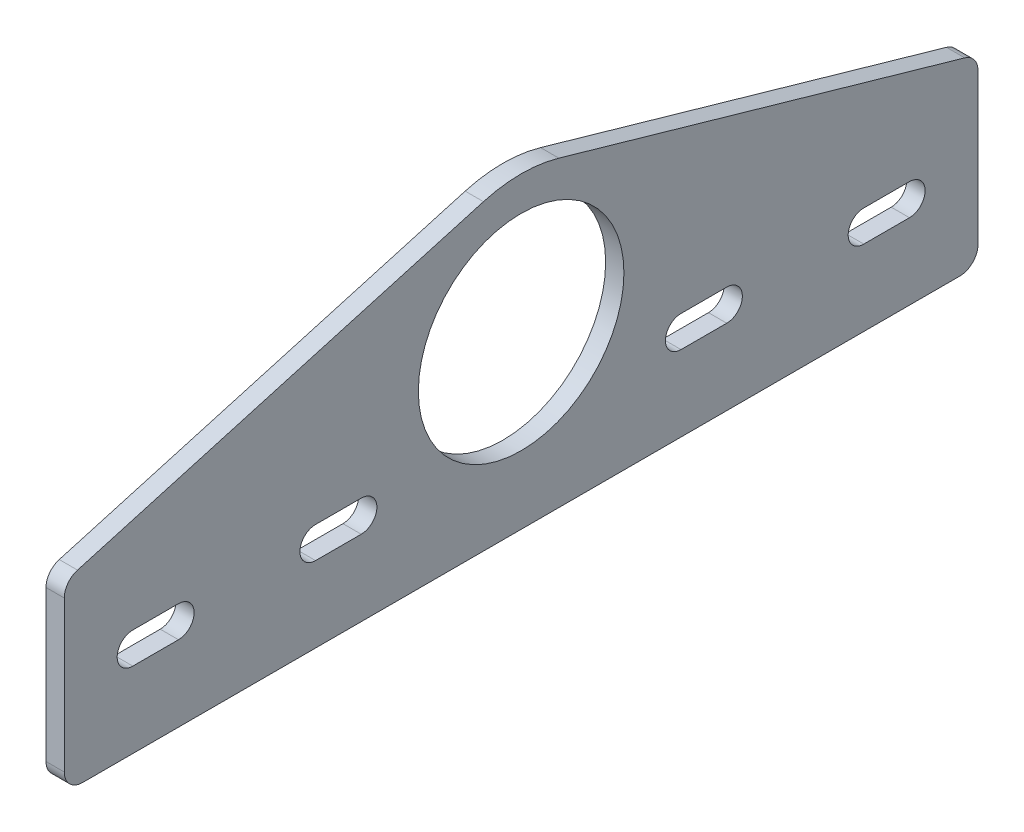
ISO-10303-21;
HEADER;
FILE_DESCRIPTION(('STEP AP214'),'2;1');
FILE_NAME('part.step','',(''),(''),'','','');
FILE_SCHEMA(('AUTOMOTIVE_DESIGN { 1 0 10303 214 1 1 1 1 }'));
ENDSEC;
DATA;
#1=APPLICATION_CONTEXT('core data for automotive mechanical design processes');
#2=APPLICATION_PROTOCOL_DEFINITION('international standard','automotive_design',2000,#1);
#3=PRODUCT_CONTEXT('',#1,'mechanical');
#4=PRODUCT('Part','Part','',(#3));
#5=PRODUCT_RELATED_PRODUCT_CATEGORY('part','',(#4));
#6=PRODUCT_DEFINITION_FORMATION('','',#4);
#7=PRODUCT_DEFINITION_CONTEXT('part definition',#1,'design');
#8=PRODUCT_DEFINITION('design','',#6,#7);
#9=PRODUCT_DEFINITION_SHAPE('','',#8);
#10=(LENGTH_UNIT() NAMED_UNIT(*) SI_UNIT(.MILLI.,.METRE.));
#11=(NAMED_UNIT(*) PLANE_ANGLE_UNIT() SI_UNIT($,.RADIAN.));
#12=(NAMED_UNIT(*) SI_UNIT($,.STERADIAN.) SOLID_ANGLE_UNIT());
#13=UNCERTAINTY_MEASURE_WITH_UNIT(LENGTH_MEASURE(1.E-05),#10,'distance_accuracy_value','');
#14=(GEOMETRIC_REPRESENTATION_CONTEXT(3) GLOBAL_UNCERTAINTY_ASSIGNED_CONTEXT((#13)) GLOBAL_UNIT_ASSIGNED_CONTEXT((#10,
#11,#12)) REPRESENTATION_CONTEXT('',''));
#15=CARTESIAN_POINT('',(0.,0.,0.));
#16=DIRECTION('',(0.,0.,1.));
#17=DIRECTION('',(1.,0.,0.));
#18=AXIS2_PLACEMENT_3D('',#15,#16,#17);
#19=CARTESIAN_POINT('',(2.54,-23.7489999999995,63.4999999999999));
#20=DIRECTION('',(0.,1.,0.));
#21=DIRECTION('',(0.,0.,1.));
#22=AXIS2_PLACEMENT_3D('',#19,#20,#21);
#23=PLANE('',#22);
#24=DIRECTION('',(0.,0.,-1.));
#25=VECTOR('',#24,1.);
#26=CARTESIAN_POINT('',(2.54,-23.7489999999995,63.4999999999999));
#27=LINE('',#26,#25);
#28=CARTESIAN_POINT('',(2.54,-23.7489999999995,60.9599999999999));
#29=VERTEX_POINT('',#28);
#30=CARTESIAN_POINT('',(2.54,-23.7489999999995,-60.9600000000001));
#31=VERTEX_POINT('',#30);
#32=EDGE_CURVE('E429',#29,#31,#27,.T.);
#33=ORIENTED_EDGE('',*,*,#32,.F.);
#34=DIRECTION('',(-1.,0.,0.));
#35=VECTOR('',#34,1.);
#36=CARTESIAN_POINT('',(0.,-23.7489999999995,60.9599999999999));
#37=LINE('',#36,#35);
#38=CARTESIAN_POINT('',(0.,-23.7489999999995,60.9599999999999));
#39=VERTEX_POINT('',#38);
#40=EDGE_CURVE('E504',#29,#39,#37,.T.);
#41=ORIENTED_EDGE('',*,*,#40,.T.);
#42=DIRECTION('',(0.,0.,-1.));
#43=VECTOR('',#42,1.);
#44=CARTESIAN_POINT('',(0.,-23.7489999999995,63.4999999999999));
#45=LINE('',#44,#43);
#46=CARTESIAN_POINT('',(0.,-23.7489999999995,-60.9600000000001));
#47=VERTEX_POINT('',#46);
#48=EDGE_CURVE('E425',#39,#47,#45,.T.);
#49=ORIENTED_EDGE('',*,*,#48,.T.);
#50=DIRECTION('',(-1.,0.,0.));
#51=VECTOR('',#50,1.);
#52=CARTESIAN_POINT('',(2.54,-23.7489999999995,-60.9600000000001));
#53=LINE('',#52,#51);
#54=EDGE_CURVE('E501',#47,#31,#53,.F.);
#55=ORIENTED_EDGE('',*,*,#54,.T.);
#56=EDGE_LOOP('',(#33,#41,#49,#55));
#57=FACE_BOUND('',#56,.T.);
#58=ADVANCED_FACE('F41',(#57),#23,.F.);
#59=CARTESIAN_POINT('',(2.54,-23.7489999999995,-63.5000000000001));
#60=DIRECTION('',(0.,0.,1.));
#61=DIRECTION('',(0.,-1.,0.));
#62=AXIS2_PLACEMENT_3D('',#59,#60,#61);
#63=PLANE('',#62);
#64=DIRECTION('',(0.,1.,0.));
#65=VECTOR('',#64,1.);
#66=CARTESIAN_POINT('',(2.54,-23.7489999999995,-63.5000000000001));
#67=LINE('',#66,#65);
#68=CARTESIAN_POINT('',(2.54,-21.2089999999995,-63.5000000000001));
#69=VERTEX_POINT('',#68);
#70=CARTESIAN_POINT('',(2.54,-0.264342598477369,-63.5000000000001));
#71=VERTEX_POINT('',#70);
#72=EDGE_CURVE('E433',#69,#71,#67,.T.);
#73=ORIENTED_EDGE('',*,*,#72,.F.);
#74=DIRECTION('',(-1.,0.,0.));
#75=VECTOR('',#74,1.);
#76=CARTESIAN_POINT('',(2.54,-21.2089999999995,-63.5000000000001));
#77=LINE('',#76,#75);
#78=CARTESIAN_POINT('',(0.,-21.2089999999995,-63.5000000000001));
#79=VERTEX_POINT('',#78);
#80=EDGE_CURVE('E49',#69,#79,#77,.T.);
#81=ORIENTED_EDGE('',*,*,#80,.T.);
#82=DIRECTION('',(0.,1.,0.));
#83=VECTOR('',#82,1.);
#84=CARTESIAN_POINT('',(0.,-23.7489999999995,-63.5000000000001));
#85=LINE('',#84,#83);
#86=CARTESIAN_POINT('',(0.,-0.264342598477369,-63.5000000000001));
#87=VERTEX_POINT('',#86);
#88=EDGE_CURVE('E454',#79,#87,#85,.T.);
#89=ORIENTED_EDGE('',*,*,#88,.T.);
#90=DIRECTION('',(-1.,0.,0.));
#91=VECTOR('',#90,1.);
#92=CARTESIAN_POINT('',(2.54,-0.264342598477362,-63.5000000000001));
#93=LINE('',#92,#91);
#94=EDGE_CURVE('E64',#87,#71,#93,.F.);
#95=ORIENTED_EDGE('',*,*,#94,.T.);
#96=EDGE_LOOP('',(#73,#81,#89,#95));
#97=FACE_BOUND('',#96,.T.);
#98=ADVANCED_FACE('F511',(#97),#63,.F.);
#99=CARTESIAN_POINT('',(2.54,1.65100000000048,-63.5000000000001));
#100=DIRECTION('',(0.,-0.961443520094269,0.275002468477541));
#101=DIRECTION('',(0.,-0.275002468477541,-0.961443520094269));
#102=AXIS2_PLACEMENT_3D('',#99,#100,#101);
#103=PLANE('',#102);
#104=DIRECTION('',(0.,0.275002468477541,0.961443520094269));
#105=VECTOR('',#104,1.);
#106=CARTESIAN_POINT('',(2.54,1.65100000000048,-63.5000000000001));
#107=LINE('',#106,#105);
#108=CARTESIAN_POINT('',(2.54,2.17772394256208,-61.6585062699331));
#109=VERTEX_POINT('',#108);
#110=CARTESIAN_POINT('',(2.54,18.3154990577958,-5.23879702449716));
#111=VERTEX_POINT('',#110);
#112=EDGE_CURVE('E437',#109,#111,#107,.T.);
#113=ORIENTED_EDGE('',*,*,#112,.F.);
#114=DIRECTION('',(-1.,0.,0.));
#115=VECTOR('',#114,1.);
#116=CARTESIAN_POINT('',(2.54,2.17772394256208,-61.6585062699331));
#117=LINE('',#116,#115);
#118=CARTESIAN_POINT('',(0.,2.17772394256208,-61.6585062699331));
#119=VERTEX_POINT('',#118);
#120=EDGE_CURVE('E11',#109,#119,#117,.T.);
#121=ORIENTED_EDGE('',*,*,#120,.T.);
#122=DIRECTION('',(0.,0.275002468477541,0.961443520094269));
#123=VECTOR('',#122,1.);
#124=CARTESIAN_POINT('',(0.,1.65100000000048,-63.5000000000001));
#125=LINE('',#124,#123);
#126=CARTESIAN_POINT('',(0.,18.3154990577958,-5.23879702449716));
#127=VERTEX_POINT('',#126);
#128=EDGE_CURVE('E457',#119,#127,#125,.T.);
#129=ORIENTED_EDGE('',*,*,#128,.T.);
#130=DIRECTION('',(-1.,0.,0.));
#131=VECTOR('',#130,1.);
#132=CARTESIAN_POINT('',(2.54,18.3154990577958,-5.23879702449716));
#133=LINE('',#132,#131);
#134=EDGE_CURVE('E473',#111,#127,#133,.T.);
#135=ORIENTED_EDGE('',*,*,#134,.F.);
#136=EDGE_LOOP('',(#113,#121,#129,#135));
#137=FACE_BOUND('',#136,.T.);
#138=ADVANCED_FACE('F522',(#137),#103,.F.);
#139=CARTESIAN_POINT('',(2.54,0.,0.));
#140=DIRECTION('',(-1.,0.,0.));
#141=DIRECTION('',(0.,0.,1.));
#142=AXIS2_PLACEMENT_3D('',#139,#140,#141);
#143=CYLINDRICAL_SURFACE('',#142,19.05);
#144=CARTESIAN_POINT('',(0.,0.,0.));
#145=DIRECTION('',(1.,0.,0.));
#146=DIRECTION('',(0.,0.,-1.));
#147=AXIS2_PLACEMENT_3D('',#144,#145,#146);
#148=CIRCLE('',#147,19.05);
#149=CARTESIAN_POINT('',(0.,18.3154990577958,5.23879702449718));
#150=VERTEX_POINT('',#149);
#151=EDGE_CURVE('E460',#127,#150,#148,.T.);
#152=ORIENTED_EDGE('',*,*,#151,.T.);
#153=DIRECTION('',(-1.,0.,0.));
#154=VECTOR('',#153,1.);
#155=CARTESIAN_POINT('',(2.54,18.3154990577958,5.23879702449718));
#156=LINE('',#155,#154);
#157=CARTESIAN_POINT('',(2.54,18.3154990577958,5.23879702449718));
#158=VERTEX_POINT('',#157);
#159=EDGE_CURVE('E450',#158,#150,#156,.T.);
#160=ORIENTED_EDGE('',*,*,#159,.F.);
#161=CARTESIAN_POINT('',(2.54,0.,0.));
#162=DIRECTION('',(1.,0.,0.));
#163=DIRECTION('',(0.,0.,-1.));
#164=AXIS2_PLACEMENT_3D('',#161,#162,#163);
#165=CIRCLE('',#164,19.05);
#166=EDGE_CURVE('E440',#111,#158,#165,.T.);
#167=ORIENTED_EDGE('',*,*,#166,.F.);
#168=ORIENTED_EDGE('',*,*,#134,.T.);
#169=EDGE_LOOP('',(#152,#160,#167,#168));
#170=FACE_BOUND('',#169,.T.);
#171=ADVANCED_FACE('F529',(#170),#143,.T.);
#172=CARTESIAN_POINT('',(2.54,18.3154990577958,5.23879702449718));
#173=DIRECTION('',(0.,-0.961443520094269,-0.275002468477542));
#174=DIRECTION('',(0.,0.275002468477542,-0.961443520094269));
#175=AXIS2_PLACEMENT_3D('',#172,#173,#174);
#176=PLANE('',#175);
#177=DIRECTION('',(0.,-0.275002468477542,0.961443520094269));
#178=VECTOR('',#177,1.);
#179=CARTESIAN_POINT('',(0.,18.3154990577958,5.23879702449718));
#180=LINE('',#179,#178);
#181=CARTESIAN_POINT('',(0.,2.17772394256208,61.6585062699328));
#182=VERTEX_POINT('',#181);
#183=EDGE_CURVE('E463',#150,#182,#180,.T.);
#184=ORIENTED_EDGE('',*,*,#183,.T.);
#185=DIRECTION('',(-1.,0.,0.));
#186=VECTOR('',#185,1.);
#187=CARTESIAN_POINT('',(2.54,2.17772394256208,61.6585062699328));
#188=LINE('',#187,#186);
#189=CARTESIAN_POINT('',(2.54,2.17772394256208,61.6585062699328));
#190=VERTEX_POINT('',#189);
#191=EDGE_CURVE('E491',#182,#190,#188,.F.);
#192=ORIENTED_EDGE('',*,*,#191,.T.);
#193=DIRECTION('',(0.,-0.275002468477542,0.961443520094269));
#194=VECTOR('',#193,1.);
#195=CARTESIAN_POINT('',(2.54,18.3154990577958,5.23879702449718));
#196=LINE('',#195,#194);
#197=EDGE_CURVE('E443',#158,#190,#196,.T.);
#198=ORIENTED_EDGE('',*,*,#197,.F.);
#199=ORIENTED_EDGE('',*,*,#159,.T.);
#200=EDGE_LOOP('',(#184,#192,#198,#199));
#201=FACE_BOUND('',#200,.T.);
#202=ADVANCED_FACE('F532',(#201),#176,.F.);
#203=CARTESIAN_POINT('',(2.54,-23.7489999999995,63.4999999999999));
#204=DIRECTION('',(0.,0.,1.));
#205=DIRECTION('',(0.,-1.,0.));
#206=AXIS2_PLACEMENT_3D('',#203,#204,#205);
#207=PLANE('',#206);
#208=DIRECTION('',(0.,1.,0.));
#209=VECTOR('',#208,1.);
#210=CARTESIAN_POINT('',(2.54,-23.7489999999995,63.4999999999999));
#211=LINE('',#210,#209);
#212=CARTESIAN_POINT('',(2.54,-21.2089999999995,63.4999999999999));
#213=VERTEX_POINT('',#212);
#214=CARTESIAN_POINT('',(2.54,-0.264342598477369,63.4999999999999));
#215=VERTEX_POINT('',#214);
#216=EDGE_CURVE('E447',#213,#215,#211,.T.);
#217=ORIENTED_EDGE('',*,*,#216,.T.);
#218=DIRECTION('',(-1.,0.,0.));
#219=VECTOR('',#218,1.);
#220=CARTESIAN_POINT('',(0.,-0.264342598477361,63.4999999999999));
#221=LINE('',#220,#219);
#222=CARTESIAN_POINT('',(0.,-0.264342598477369,63.4999999999999));
#223=VERTEX_POINT('',#222);
#224=EDGE_CURVE('E479',#215,#223,#221,.T.);
#225=ORIENTED_EDGE('',*,*,#224,.T.);
#226=DIRECTION('',(0.,1.,0.));
#227=VECTOR('',#226,1.);
#228=CARTESIAN_POINT('',(0.,-23.7489999999995,63.4999999999999));
#229=LINE('',#228,#227);
#230=CARTESIAN_POINT('',(0.,-21.2089999999995,63.4999999999999));
#231=VERTEX_POINT('',#230);
#232=EDGE_CURVE('E434',#231,#223,#229,.T.);
#233=ORIENTED_EDGE('',*,*,#232,.F.);
#234=DIRECTION('',(-1.,0.,0.));
#235=VECTOR('',#234,1.);
#236=CARTESIAN_POINT('',(2.54,-21.2089999999995,63.4999999999999));
#237=LINE('',#236,#235);
#238=EDGE_CURVE('E477',#231,#213,#237,.F.);
#239=ORIENTED_EDGE('',*,*,#238,.T.);
#240=EDGE_LOOP('',(#217,#225,#233,#239));
#241=FACE_BOUND('',#240,.T.);
#242=ADVANCED_FACE('F540',(#241),#207,.T.);
#243=CARTESIAN_POINT('',(2.54,0.,0.));
#244=DIRECTION('',(1.,0.,0.));
#245=DIRECTION('',(0.,0.,-1.));
#246=AXIS2_PLACEMENT_3D('',#243,#244,#245);
#247=PLANE('',#246);
#248=CARTESIAN_POINT('',(2.54,-11.0489999999995,47.6249999999998));
#249=DIRECTION('',(-1.,0.,0.));
#250=DIRECTION('',(0.,0.,1.));
#251=AXIS2_PLACEMENT_3D('',#248,#249,#250);
#252=CIRCLE('',#251,2.1717);
#253=CARTESIAN_POINT('',(2.54,-8.87729999999952,47.6249999999998));
#254=VERTEX_POINT('',#253);
#255=CARTESIAN_POINT('',(2.54,-13.2206999999995,47.6249999999998));
#256=VERTEX_POINT('',#255);
#257=EDGE_CURVE('E390',#254,#256,#252,.T.);
#258=ORIENTED_EDGE('',*,*,#257,.T.);
#259=DIRECTION('',(0.,0.,1.));
#260=VECTOR('',#259,1.);
#261=CARTESIAN_POINT('',(2.54,-13.2206999999995,47.6249999999998));
#262=LINE('',#261,#260);
#263=CARTESIAN_POINT('',(2.54,-13.2206999999995,53.9749999999998));
#264=VERTEX_POINT('',#263);
#265=EDGE_CURVE('E393',#256,#264,#262,.T.);
#266=ORIENTED_EDGE('',*,*,#265,.T.);
#267=CARTESIAN_POINT('',(2.54,-11.0489999999995,53.9749999999998));
#268=DIRECTION('',(-1.,0.,0.));
#269=DIRECTION('',(0.,0.,1.));
#270=AXIS2_PLACEMENT_3D('',#267,#268,#269);
#271=CIRCLE('',#270,2.1717);
#272=CARTESIAN_POINT('',(2.54,-8.87729999999952,53.9749999999998));
#273=VERTEX_POINT('',#272);
#274=EDGE_CURVE('E397',#264,#273,#271,.T.);
#275=ORIENTED_EDGE('',*,*,#274,.T.);
#276=DIRECTION('',(0.,0.,-1.));
#277=VECTOR('',#276,1.);
#278=CARTESIAN_POINT('',(2.54,-8.87729999999952,47.6249999999998));
#279=LINE('',#278,#277);
#280=EDGE_CURVE('E400',#273,#254,#279,.T.);
#281=ORIENTED_EDGE('',*,*,#280,.T.);
#282=EDGE_LOOP('',(#258,#266,#275,#281));
#283=FACE_BOUND('',#282,.T.);
#284=CARTESIAN_POINT('',(2.54,-11.0489999999995,22.2249999999998));
#285=DIRECTION('',(-1.,0.,0.));
#286=DIRECTION('',(0.,0.,1.));
#287=AXIS2_PLACEMENT_3D('',#284,#285,#286);
#288=CIRCLE('',#287,2.1717);
#289=CARTESIAN_POINT('',(2.54,-8.87729999999952,22.2249999999998));
#290=VERTEX_POINT('',#289);
#291=CARTESIAN_POINT('',(2.54,-13.2206999999995,22.2249999999998));
#292=VERTEX_POINT('',#291);
#293=EDGE_CURVE('E346',#290,#292,#288,.T.);
#294=ORIENTED_EDGE('',*,*,#293,.T.);
#295=DIRECTION('',(0.,0.,1.));
#296=VECTOR('',#295,1.);
#297=CARTESIAN_POINT('',(2.54,-13.2206999999995,22.2249999999998));
#298=LINE('',#297,#296);
#299=CARTESIAN_POINT('',(2.54,-13.2206999999995,28.5749999999998));
#300=VERTEX_POINT('',#299);
#301=EDGE_CURVE('E350',#292,#300,#298,.T.);
#302=ORIENTED_EDGE('',*,*,#301,.T.);
#303=CARTESIAN_POINT('',(2.54,-11.0489999999995,28.5749999999998));
#304=DIRECTION('',(-1.,0.,0.));
#305=DIRECTION('',(0.,0.,1.));
#306=AXIS2_PLACEMENT_3D('',#303,#304,#305);
#307=CIRCLE('',#306,2.1717);
#308=CARTESIAN_POINT('',(2.54,-8.87729999999952,28.5749999999998));
#309=VERTEX_POINT('',#308);
#310=EDGE_CURVE('E355',#300,#309,#307,.T.);
#311=ORIENTED_EDGE('',*,*,#310,.T.);
#312=DIRECTION('',(0.,0.,-1.));
#313=VECTOR('',#312,1.);
#314=CARTESIAN_POINT('',(2.54,-8.87729999999952,22.2249999999998));
#315=LINE('',#314,#313);
#316=EDGE_CURVE('E359',#309,#290,#315,.T.);
#317=ORIENTED_EDGE('',*,*,#316,.T.);
#318=EDGE_LOOP('',(#294,#302,#311,#317));
#319=FACE_BOUND('',#318,.T.);
#320=CARTESIAN_POINT('',(2.54,-11.0489999999995,-28.5750000000001));
#321=DIRECTION('',(-1.,0.,0.));
#322=DIRECTION('',(0.,0.,1.));
#323=AXIS2_PLACEMENT_3D('',#320,#321,#322);
#324=CIRCLE('',#323,2.1717);
#325=CARTESIAN_POINT('',(2.54,-8.87729999999952,-28.5750000000001));
#326=VERTEX_POINT('',#325);
#327=CARTESIAN_POINT('',(2.54,-13.2206999999995,-28.5750000000001));
#328=VERTEX_POINT('',#327);
#329=EDGE_CURVE('E302',#326,#328,#324,.T.);
#330=ORIENTED_EDGE('',*,*,#329,.T.);
#331=DIRECTION('',(0.,0.,1.));
#332=VECTOR('',#331,1.);
#333=CARTESIAN_POINT('',(2.54,-13.2206999999995,-28.5750000000001));
#334=LINE('',#333,#332);
#335=CARTESIAN_POINT('',(2.54,-13.2206999999995,-22.2250000000001));
#336=VERTEX_POINT('',#335);
#337=EDGE_CURVE('E306',#328,#336,#334,.T.);
#338=ORIENTED_EDGE('',*,*,#337,.T.);
#339=CARTESIAN_POINT('',(2.54,-11.0489999999995,-22.2250000000001));
#340=DIRECTION('',(-1.,0.,0.));
#341=DIRECTION('',(0.,0.,1.));
#342=AXIS2_PLACEMENT_3D('',#339,#340,#341);
#343=CIRCLE('',#342,2.1717);
#344=CARTESIAN_POINT('',(2.54,-8.87729999999952,-22.2250000000001));
#345=VERTEX_POINT('',#344);
#346=EDGE_CURVE('E311',#336,#345,#343,.T.);
#347=ORIENTED_EDGE('',*,*,#346,.T.);
#348=DIRECTION('',(0.,0.,-1.));
#349=VECTOR('',#348,1.);
#350=CARTESIAN_POINT('',(2.54,-8.87729999999952,-28.5750000000001));
#351=LINE('',#350,#349);
#352=EDGE_CURVE('E315',#345,#326,#351,.T.);
#353=ORIENTED_EDGE('',*,*,#352,.T.);
#354=EDGE_LOOP('',(#330,#338,#347,#353));
#355=FACE_BOUND('',#354,.T.);
#356=CARTESIAN_POINT('',(2.54,-11.0489999999995,-53.9750000000001));
#357=DIRECTION('',(-1.,0.,0.));
#358=DIRECTION('',(0.,0.,1.));
#359=AXIS2_PLACEMENT_3D('',#356,#357,#358);
#360=CIRCLE('',#359,2.1717);
#361=CARTESIAN_POINT('',(2.54,-8.87729999999952,-53.9750000000001));
#362=VERTEX_POINT('',#361);
#363=CARTESIAN_POINT('',(2.54,-13.2206999999995,-53.9750000000001));
#364=VERTEX_POINT('',#363);
#365=EDGE_CURVE('E250',#362,#364,#360,.T.);
#366=ORIENTED_EDGE('',*,*,#365,.T.);
#367=DIRECTION('',(0.,0.,1.));
#368=VECTOR('',#367,1.);
#369=CARTESIAN_POINT('',(2.54,-13.2206999999995,-53.9750000000001));
#370=LINE('',#369,#368);
#371=CARTESIAN_POINT('',(2.54,-13.2206999999995,-47.6250000000001));
#372=VERTEX_POINT('',#371);
#373=EDGE_CURVE('E263',#364,#372,#370,.T.);
#374=ORIENTED_EDGE('',*,*,#373,.T.);
#375=CARTESIAN_POINT('',(2.54,-11.0489999999995,-47.6250000000001));
#376=DIRECTION('',(-1.,0.,0.));
#377=DIRECTION('',(0.,0.,1.));
#378=AXIS2_PLACEMENT_3D('',#375,#376,#377);
#379=CIRCLE('',#378,2.1717);
#380=CARTESIAN_POINT('',(2.54,-8.87729999999952,-47.6250000000001));
#381=VERTEX_POINT('',#380);
#382=EDGE_CURVE('E268',#372,#381,#379,.T.);
#383=ORIENTED_EDGE('',*,*,#382,.T.);
#384=DIRECTION('',(0.,0.,-1.));
#385=VECTOR('',#384,1.);
#386=CARTESIAN_POINT('',(2.54,-8.87729999999952,-53.9750000000001));
#387=LINE('',#386,#385);
#388=EDGE_CURVE('E259',#381,#362,#387,.T.);
#389=ORIENTED_EDGE('',*,*,#388,.T.);
#390=EDGE_LOOP('',(#366,#374,#383,#389));
#391=FACE_BOUND('',#390,.T.);
#392=CARTESIAN_POINT('',(2.54,0.,0.));
#393=DIRECTION('',(-1.,0.,0.));
#394=DIRECTION('',(0.,0.,1.));
#395=AXIS2_PLACEMENT_3D('',#392,#393,#394);
#396=CIRCLE('',#395,14.2875);
#397=CARTESIAN_POINT('',(2.54,0.,14.2875));
#398=VERTEX_POINT('',#397);
#399=EDGE_CURVE('E421',#398,#398,#396,.T.);
#400=ORIENTED_EDGE('',*,*,#399,.T.);
#401=EDGE_LOOP('',(#400));
#402=FACE_BOUND('',#401,.T.);
#403=ORIENTED_EDGE('',*,*,#197,.T.);
#404=CARTESIAN_POINT('',(2.54,-0.264342598477362,60.9599999999999));
#405=DIRECTION('',(1.,0.,0.));
#406=DIRECTION('',(0.,0.,-1.));
#407=AXIS2_PLACEMENT_3D('',#404,#405,#406);
#408=CIRCLE('',#407,2.54);
#409=EDGE_CURVE('E499',#190,#215,#408,.T.);
#410=ORIENTED_EDGE('',*,*,#409,.T.);
#411=ORIENTED_EDGE('',*,*,#216,.F.);
#412=CARTESIAN_POINT('',(2.54,-21.2089999999995,60.9599999999999));
#413=DIRECTION('',(1.,0.,0.));
#414=DIRECTION('',(0.,0.,-1.));
#415=AXIS2_PLACEMENT_3D('',#412,#413,#414);
#416=CIRCLE('',#415,2.54);
#417=EDGE_CURVE('E497',#213,#29,#416,.T.);
#418=ORIENTED_EDGE('',*,*,#417,.T.);
#419=ORIENTED_EDGE('',*,*,#32,.T.);
#420=CARTESIAN_POINT('',(2.54,-21.2089999999995,-60.9600000000001));
#421=DIRECTION('',(1.,0.,0.));
#422=DIRECTION('',(0.,0.,-1.));
#423=AXIS2_PLACEMENT_3D('',#420,#421,#422);
#424=CIRCLE('',#423,2.54);
#425=EDGE_CURVE('E494',#31,#69,#424,.T.);
#426=ORIENTED_EDGE('',*,*,#425,.T.);
#427=ORIENTED_EDGE('',*,*,#72,.T.);
#428=CARTESIAN_POINT('',(2.54,-0.264342598477365,-60.9600000000001));
#429=DIRECTION('',(1.,0.,0.));
#430=DIRECTION('',(0.,0.,-1.));
#431=AXIS2_PLACEMENT_3D('',#428,#429,#430);
#432=CIRCLE('',#431,2.54);
#433=EDGE_CURVE('E56',#71,#109,#432,.T.);
#434=ORIENTED_EDGE('',*,*,#433,.T.);
#435=ORIENTED_EDGE('',*,*,#112,.T.);
#436=ORIENTED_EDGE('',*,*,#166,.T.);
#437=EDGE_LOOP('',(#403,#410,#411,#418,#419,#426,#427,#434,#435,#436));
#438=FACE_BOUND('',#437,.T.);
#439=ADVANCED_FACE('F270',(#283,#319,#355,#391,#402,#438),#247,.T.);
#440=CARTESIAN_POINT('',(0.,0.,0.));
#441=DIRECTION('',(1.,0.,0.));
#442=DIRECTION('',(0.,0.,-1.));
#443=AXIS2_PLACEMENT_3D('',#440,#441,#442);
#444=PLANE('',#443);
#445=DIRECTION('',(0.,0.,1.));
#446=VECTOR('',#445,1.);
#447=CARTESIAN_POINT('',(0.,-13.2206999999995,47.6249999999998));
#448=LINE('',#447,#446);
#449=CARTESIAN_POINT('',(0.,-13.2206999999995,47.6249999999998));
#450=VERTEX_POINT('',#449);
#451=CARTESIAN_POINT('',(0.,-13.2206999999995,53.9749999999998));
#452=VERTEX_POINT('',#451);
#453=EDGE_CURVE('E406',#450,#452,#448,.T.);
#454=ORIENTED_EDGE('',*,*,#453,.F.);
#455=CARTESIAN_POINT('',(0.,-11.0489999999995,47.6249999999998));
#456=DIRECTION('',(-1.,0.,0.));
#457=DIRECTION('',(0.,0.,1.));
#458=AXIS2_PLACEMENT_3D('',#455,#456,#457);
#459=CIRCLE('',#458,2.1717);
#460=CARTESIAN_POINT('',(0.,-8.87729999999952,47.6249999999998));
#461=VERTEX_POINT('',#460);
#462=EDGE_CURVE('E404',#461,#450,#459,.T.);
#463=ORIENTED_EDGE('',*,*,#462,.F.);
#464=DIRECTION('',(0.,0.,-1.));
#465=VECTOR('',#464,1.);
#466=CARTESIAN_POINT('',(0.,-8.87729999999952,47.6249999999998));
#467=LINE('',#466,#465);
#468=CARTESIAN_POINT('',(0.,-8.87729999999952,53.9749999999998));
#469=VERTEX_POINT('',#468);
#470=EDGE_CURVE('E394',#469,#461,#467,.T.);
#471=ORIENTED_EDGE('',*,*,#470,.F.);
#472=CARTESIAN_POINT('',(0.,-11.0489999999995,53.9749999999998));
#473=DIRECTION('',(-1.,0.,0.));
#474=DIRECTION('',(0.,0.,1.));
#475=AXIS2_PLACEMENT_3D('',#472,#473,#474);
#476=CIRCLE('',#475,2.1717);
#477=EDGE_CURVE('E409',#452,#469,#476,.T.);
#478=ORIENTED_EDGE('',*,*,#477,.F.);
#479=EDGE_LOOP('',(#454,#463,#471,#478));
#480=FACE_BOUND('',#479,.T.);
#481=DIRECTION('',(0.,0.,1.));
#482=VECTOR('',#481,1.);
#483=CARTESIAN_POINT('',(0.,-13.2206999999995,22.2249999999998));
#484=LINE('',#483,#482);
#485=CARTESIAN_POINT('',(0.,-13.2206999999995,22.2249999999998));
#486=VERTEX_POINT('',#485);
#487=CARTESIAN_POINT('',(0.,-13.2206999999995,28.5749999999998));
#488=VERTEX_POINT('',#487);
#489=EDGE_CURVE('E367',#486,#488,#484,.T.);
#490=ORIENTED_EDGE('',*,*,#489,.F.);
#491=CARTESIAN_POINT('',(0.,-11.0489999999995,22.2249999999998));
#492=DIRECTION('',(-1.,0.,0.));
#493=DIRECTION('',(0.,0.,1.));
#494=AXIS2_PLACEMENT_3D('',#491,#492,#493);
#495=CIRCLE('',#494,2.1717);
#496=CARTESIAN_POINT('',(0.,-8.87729999999952,22.2249999999998));
#497=VERTEX_POINT('',#496);
#498=EDGE_CURVE('E364',#497,#486,#495,.T.);
#499=ORIENTED_EDGE('',*,*,#498,.F.);
#500=DIRECTION('',(0.,0.,-1.));
#501=VECTOR('',#500,1.);
#502=CARTESIAN_POINT('',(0.,-8.87729999999952,22.2249999999998));
#503=LINE('',#502,#501);
#504=CARTESIAN_POINT('',(0.,-8.87729999999952,28.5749999999998));
#505=VERTEX_POINT('',#504);
#506=EDGE_CURVE('E351',#505,#497,#503,.T.);
#507=ORIENTED_EDGE('',*,*,#506,.F.);
#508=CARTESIAN_POINT('',(0.,-11.0489999999995,28.5749999999998));
#509=DIRECTION('',(-1.,0.,0.));
#510=DIRECTION('',(0.,0.,1.));
#511=AXIS2_PLACEMENT_3D('',#508,#509,#510);
#512=CIRCLE('',#511,2.1717);
#513=EDGE_CURVE('E372',#488,#505,#512,.T.);
#514=ORIENTED_EDGE('',*,*,#513,.F.);
#515=EDGE_LOOP('',(#490,#499,#507,#514));
#516=FACE_BOUND('',#515,.T.);
#517=DIRECTION('',(0.,0.,1.));
#518=VECTOR('',#517,1.);
#519=CARTESIAN_POINT('',(0.,-13.2206999999995,-28.5750000000001));
#520=LINE('',#519,#518);
#521=CARTESIAN_POINT('',(0.,-13.2206999999995,-28.5750000000001));
#522=VERTEX_POINT('',#521);
#523=CARTESIAN_POINT('',(0.,-13.2206999999995,-22.2250000000001));
#524=VERTEX_POINT('',#523);
#525=EDGE_CURVE('E323',#522,#524,#520,.T.);
#526=ORIENTED_EDGE('',*,*,#525,.F.);
#527=CARTESIAN_POINT('',(0.,-11.0489999999995,-28.5750000000001));
#528=DIRECTION('',(-1.,0.,0.));
#529=DIRECTION('',(0.,0.,1.));
#530=AXIS2_PLACEMENT_3D('',#527,#528,#529);
#531=CIRCLE('',#530,2.1717);
#532=CARTESIAN_POINT('',(0.,-8.87729999999952,-28.5750000000001));
#533=VERTEX_POINT('',#532);
#534=EDGE_CURVE('E320',#533,#522,#531,.T.);
#535=ORIENTED_EDGE('',*,*,#534,.F.);
#536=DIRECTION('',(0.,0.,-1.));
#537=VECTOR('',#536,1.);
#538=CARTESIAN_POINT('',(0.,-8.87729999999952,-28.5750000000001));
#539=LINE('',#538,#537);
#540=CARTESIAN_POINT('',(0.,-8.87729999999952,-22.2250000000001));
#541=VERTEX_POINT('',#540);
#542=EDGE_CURVE('E307',#541,#533,#539,.T.);
#543=ORIENTED_EDGE('',*,*,#542,.F.);
#544=CARTESIAN_POINT('',(0.,-11.0489999999995,-22.2250000000001));
#545=DIRECTION('',(-1.,0.,0.));
#546=DIRECTION('',(0.,0.,1.));
#547=AXIS2_PLACEMENT_3D('',#544,#545,#546);
#548=CIRCLE('',#547,2.1717);
#549=EDGE_CURVE('E328',#524,#541,#548,.T.);
#550=ORIENTED_EDGE('',*,*,#549,.F.);
#551=EDGE_LOOP('',(#526,#535,#543,#550));
#552=FACE_BOUND('',#551,.T.);
#553=DIRECTION('',(0.,0.,1.));
#554=VECTOR('',#553,1.);
#555=CARTESIAN_POINT('',(0.,-13.2206999999995,-53.9750000000001));
#556=LINE('',#555,#554);
#557=CARTESIAN_POINT('',(0.,-13.2206999999995,-53.9750000000001));
#558=VERTEX_POINT('',#557);
#559=CARTESIAN_POINT('',(0.,-13.2206999999995,-47.6250000000001));
#560=VERTEX_POINT('',#559);
#561=EDGE_CURVE('E287',#558,#560,#556,.T.);
#562=ORIENTED_EDGE('',*,*,#561,.F.);
#563=CARTESIAN_POINT('',(0.,-11.0489999999995,-53.9750000000001));
#564=DIRECTION('',(-1.,0.,0.));
#565=DIRECTION('',(0.,0.,1.));
#566=AXIS2_PLACEMENT_3D('',#563,#564,#565);
#567=CIRCLE('',#566,2.1717);
#568=CARTESIAN_POINT('',(0.,-8.87729999999952,-53.9750000000001));
#569=VERTEX_POINT('',#568);
#570=EDGE_CURVE('E253',#569,#558,#567,.T.);
#571=ORIENTED_EDGE('',*,*,#570,.F.);
#572=DIRECTION('',(0.,0.,-1.));
#573=VECTOR('',#572,1.);
#574=CARTESIAN_POINT('',(0.,-8.87729999999952,-53.9750000000001));
#575=LINE('',#574,#573);
#576=CARTESIAN_POINT('',(0.,-8.87729999999952,-47.6250000000001));
#577=VERTEX_POINT('',#576);
#578=EDGE_CURVE('E274',#577,#569,#575,.T.);
#579=ORIENTED_EDGE('',*,*,#578,.F.);
#580=CARTESIAN_POINT('',(0.,-11.0489999999995,-47.6250000000001));
#581=DIRECTION('',(-1.,0.,0.));
#582=DIRECTION('',(0.,0.,1.));
#583=AXIS2_PLACEMENT_3D('',#580,#581,#582);
#584=CIRCLE('',#583,2.1717);
#585=EDGE_CURVE('E278',#560,#577,#584,.T.);
#586=ORIENTED_EDGE('',*,*,#585,.F.);
#587=EDGE_LOOP('',(#562,#571,#579,#586));
#588=FACE_BOUND('',#587,.T.);
#589=CARTESIAN_POINT('',(0.,0.,0.));
#590=DIRECTION('',(-1.,0.,0.));
#591=DIRECTION('',(0.,0.,1.));
#592=AXIS2_PLACEMENT_3D('',#589,#590,#591);
#593=CIRCLE('',#592,14.2875);
#594=CARTESIAN_POINT('',(0.,0.,14.2875));
#595=VERTEX_POINT('',#594);
#596=EDGE_CURVE('E296',#595,#595,#593,.T.);
#597=ORIENTED_EDGE('',*,*,#596,.F.);
#598=EDGE_LOOP('',(#597));
#599=FACE_BOUND('',#598,.T.);
#600=ORIENTED_EDGE('',*,*,#232,.T.);
#601=CARTESIAN_POINT('',(0.,-0.264342598477362,60.9599999999999));
#602=DIRECTION('',(1.,0.,0.));
#603=DIRECTION('',(0.,0.,-1.));
#604=AXIS2_PLACEMENT_3D('',#601,#602,#603);
#605=CIRCLE('',#604,2.54);
#606=EDGE_CURVE('E489',#223,#182,#605,.F.);
#607=ORIENTED_EDGE('',*,*,#606,.T.);
#608=ORIENTED_EDGE('',*,*,#183,.F.);
#609=ORIENTED_EDGE('',*,*,#151,.F.);
#610=ORIENTED_EDGE('',*,*,#128,.F.);
#611=CARTESIAN_POINT('',(0.,-0.264342598477365,-60.9600000000001));
#612=DIRECTION('',(1.,0.,0.));
#613=DIRECTION('',(0.,0.,-1.));
#614=AXIS2_PLACEMENT_3D('',#611,#612,#613);
#615=CIRCLE('',#614,2.54);
#616=EDGE_CURVE('E482',#119,#87,#615,.F.);
#617=ORIENTED_EDGE('',*,*,#616,.T.);
#618=ORIENTED_EDGE('',*,*,#88,.F.);
#619=CARTESIAN_POINT('',(0.,-21.2089999999995,-60.9600000000001));
#620=DIRECTION('',(1.,0.,0.));
#621=DIRECTION('',(0.,0.,-1.));
#622=AXIS2_PLACEMENT_3D('',#619,#620,#621);
#623=CIRCLE('',#622,2.54);
#624=EDGE_CURVE('E484',#79,#47,#623,.F.);
#625=ORIENTED_EDGE('',*,*,#624,.T.);
#626=ORIENTED_EDGE('',*,*,#48,.F.);
#627=CARTESIAN_POINT('',(0.,-21.2089999999995,60.9599999999999));
#628=DIRECTION('',(1.,0.,0.));
#629=DIRECTION('',(0.,0.,-1.));
#630=AXIS2_PLACEMENT_3D('',#627,#628,#629);
#631=CIRCLE('',#630,2.54);
#632=EDGE_CURVE('E487',#39,#231,#631,.F.);
#633=ORIENTED_EDGE('',*,*,#632,.T.);
#634=EDGE_LOOP('',(#600,#607,#608,#609,#610,#617,#618,#625,#626,#633));
#635=FACE_BOUND('',#634,.T.);
#636=ADVANCED_FACE('F515',(#480,#516,#552,#588,#599,#635),#444,.F.);
#637=CARTESIAN_POINT('',(2.54,0.,0.));
#638=DIRECTION('',(-1.,0.,0.));
#639=DIRECTION('',(0.,0.,1.));
#640=AXIS2_PLACEMENT_3D('',#637,#638,#639);
#641=CYLINDRICAL_SURFACE('',#640,14.2875);
#642=ORIENTED_EDGE('',*,*,#399,.F.);
#643=EDGE_LOOP('',(#642));
#644=FACE_BOUND('',#643,.T.);
#645=ORIENTED_EDGE('',*,*,#596,.T.);
#646=EDGE_LOOP('',(#645));
#647=FACE_BOUND('',#646,.T.);
#648=ADVANCED_FACE('F585',(#644,#647),#641,.F.);
#649=CARTESIAN_POINT('',(2.54,-11.0489999999995,-53.9750000000001));
#650=DIRECTION('',(-1.,0.,0.));
#651=DIRECTION('',(0.,0.,1.));
#652=AXIS2_PLACEMENT_3D('',#649,#650,#651);
#653=CYLINDRICAL_SURFACE('',#652,2.1717);
#654=ORIENTED_EDGE('',*,*,#570,.T.);
#655=DIRECTION('',(-1.,0.,0.));
#656=VECTOR('',#655,1.);
#657=CARTESIAN_POINT('',(2.54,-13.2206999999995,-53.9750000000001));
#658=LINE('',#657,#656);
#659=EDGE_CURVE('E246',#364,#558,#658,.T.);
#660=ORIENTED_EDGE('',*,*,#659,.F.);
#661=ORIENTED_EDGE('',*,*,#365,.F.);
#662=DIRECTION('',(-1.,0.,0.));
#663=VECTOR('',#662,1.);
#664=CARTESIAN_POINT('',(2.54,-8.87729999999952,-53.9750000000001));
#665=LINE('',#664,#663);
#666=EDGE_CURVE('E294',#362,#569,#665,.T.);
#667=ORIENTED_EDGE('',*,*,#666,.T.);
#668=EDGE_LOOP('',(#654,#660,#661,#667));
#669=FACE_BOUND('',#668,.T.);
#670=ADVANCED_FACE('F248',(#669),#653,.F.);
#671=CARTESIAN_POINT('',(2.54,-8.87729999999952,-53.9750000000001));
#672=DIRECTION('',(0.,1.,0.));
#673=DIRECTION('',(0.,0.,1.));
#674=AXIS2_PLACEMENT_3D('',#671,#672,#673);
#675=PLANE('',#674);
#676=ORIENTED_EDGE('',*,*,#578,.T.);
#677=ORIENTED_EDGE('',*,*,#666,.F.);
#678=ORIENTED_EDGE('',*,*,#388,.F.);
#679=DIRECTION('',(-1.,0.,0.));
#680=VECTOR('',#679,1.);
#681=CARTESIAN_POINT('',(2.54,-8.87729999999952,-47.6250000000001));
#682=LINE('',#681,#680);
#683=EDGE_CURVE('E297',#381,#577,#682,.T.);
#684=ORIENTED_EDGE('',*,*,#683,.T.);
#685=EDGE_LOOP('',(#676,#677,#678,#684));
#686=FACE_BOUND('',#685,.T.);
#687=ADVANCED_FACE('F635',(#686),#675,.F.);
#688=CARTESIAN_POINT('',(2.54,-11.0489999999995,-47.6250000000001));
#689=DIRECTION('',(-1.,0.,0.));
#690=DIRECTION('',(0.,0.,1.));
#691=AXIS2_PLACEMENT_3D('',#688,#689,#690);
#692=CYLINDRICAL_SURFACE('',#691,2.1717);
#693=ORIENTED_EDGE('',*,*,#585,.T.);
#694=ORIENTED_EDGE('',*,*,#683,.F.);
#695=ORIENTED_EDGE('',*,*,#382,.F.);
#696=DIRECTION('',(-1.,0.,0.));
#697=VECTOR('',#696,1.);
#698=CARTESIAN_POINT('',(2.54,-13.2206999999995,-47.6250000000001));
#699=LINE('',#698,#697);
#700=EDGE_CURVE('E258',#372,#560,#699,.T.);
#701=ORIENTED_EDGE('',*,*,#700,.T.);
#702=EDGE_LOOP('',(#693,#694,#695,#701));
#703=FACE_BOUND('',#702,.T.);
#704=ADVANCED_FACE('F642',(#703),#692,.F.);
#705=CARTESIAN_POINT('',(2.54,-13.2206999999995,-53.9750000000001));
#706=DIRECTION('',(0.,-1.,0.));
#707=DIRECTION('',(0.,0.,-1.));
#708=AXIS2_PLACEMENT_3D('',#705,#706,#707);
#709=PLANE('',#708);
#710=ORIENTED_EDGE('',*,*,#561,.T.);
#711=ORIENTED_EDGE('',*,*,#700,.F.);
#712=ORIENTED_EDGE('',*,*,#373,.F.);
#713=ORIENTED_EDGE('',*,*,#659,.T.);
#714=EDGE_LOOP('',(#710,#711,#712,#713));
#715=FACE_BOUND('',#714,.T.);
#716=ADVANCED_FACE('F264',(#715),#709,.F.);
#717=CARTESIAN_POINT('',(2.54,-11.0489999999995,-28.5750000000001));
#718=DIRECTION('',(-1.,0.,0.));
#719=DIRECTION('',(0.,0.,1.));
#720=AXIS2_PLACEMENT_3D('',#717,#718,#719);
#721=CYLINDRICAL_SURFACE('',#720,2.1717);
#722=ORIENTED_EDGE('',*,*,#534,.T.);
#723=DIRECTION('',(-1.,0.,0.));
#724=VECTOR('',#723,1.);
#725=CARTESIAN_POINT('',(2.54,-13.2206999999995,-28.5750000000001));
#726=LINE('',#725,#724);
#727=EDGE_CURVE('E319',#328,#522,#726,.T.);
#728=ORIENTED_EDGE('',*,*,#727,.F.);
#729=ORIENTED_EDGE('',*,*,#329,.F.);
#730=DIRECTION('',(-1.,0.,0.));
#731=VECTOR('',#730,1.);
#732=CARTESIAN_POINT('',(2.54,-8.87729999999952,-28.5750000000001));
#733=LINE('',#732,#731);
#734=EDGE_CURVE('E288',#326,#533,#733,.T.);
#735=ORIENTED_EDGE('',*,*,#734,.T.);
#736=EDGE_LOOP('',(#722,#728,#729,#735));
#737=FACE_BOUND('',#736,.T.);
#738=ADVANCED_FACE('F657',(#737),#721,.F.);
#739=CARTESIAN_POINT('',(2.54,-8.87729999999952,-28.5750000000001));
#740=DIRECTION('',(0.,1.,0.));
#741=DIRECTION('',(0.,0.,1.));
#742=AXIS2_PLACEMENT_3D('',#739,#740,#741);
#743=PLANE('',#742);
#744=ORIENTED_EDGE('',*,*,#542,.T.);
#745=ORIENTED_EDGE('',*,*,#734,.F.);
#746=ORIENTED_EDGE('',*,*,#352,.F.);
#747=DIRECTION('',(-1.,0.,0.));
#748=VECTOR('',#747,1.);
#749=CARTESIAN_POINT('',(2.54,-8.87729999999952,-22.2250000000001));
#750=LINE('',#749,#748);
#751=EDGE_CURVE('E337',#345,#541,#750,.T.);
#752=ORIENTED_EDGE('',*,*,#751,.T.);
#753=EDGE_LOOP('',(#744,#745,#746,#752));
#754=FACE_BOUND('',#753,.T.);
#755=ADVANCED_FACE('F664',(#754),#743,.F.);
#756=CARTESIAN_POINT('',(2.54,-11.0489999999995,-22.2250000000001));
#757=DIRECTION('',(-1.,0.,0.));
#758=DIRECTION('',(0.,0.,1.));
#759=AXIS2_PLACEMENT_3D('',#756,#757,#758);
#760=CYLINDRICAL_SURFACE('',#759,2.1717);
#761=ORIENTED_EDGE('',*,*,#549,.T.);
#762=ORIENTED_EDGE('',*,*,#751,.F.);
#763=ORIENTED_EDGE('',*,*,#346,.F.);
#764=DIRECTION('',(-1.,0.,0.));
#765=VECTOR('',#764,1.);
#766=CARTESIAN_POINT('',(2.54,-13.2206999999995,-22.2250000000001));
#767=LINE('',#766,#765);
#768=EDGE_CURVE('E340',#336,#524,#767,.T.);
#769=ORIENTED_EDGE('',*,*,#768,.T.);
#770=EDGE_LOOP('',(#761,#762,#763,#769));
#771=FACE_BOUND('',#770,.T.);
#772=ADVANCED_FACE('F672',(#771),#760,.F.);
#773=CARTESIAN_POINT('',(2.54,-13.2206999999995,-28.5750000000001));
#774=DIRECTION('',(0.,-1.,0.));
#775=DIRECTION('',(0.,0.,-1.));
#776=AXIS2_PLACEMENT_3D('',#773,#774,#775);
#777=PLANE('',#776);
#778=ORIENTED_EDGE('',*,*,#525,.T.);
#779=ORIENTED_EDGE('',*,*,#768,.F.);
#780=ORIENTED_EDGE('',*,*,#337,.F.);
#781=ORIENTED_EDGE('',*,*,#727,.T.);
#782=EDGE_LOOP('',(#778,#779,#780,#781));
#783=FACE_BOUND('',#782,.T.);
#784=ADVANCED_FACE('F680',(#783),#777,.F.);
#785=CARTESIAN_POINT('',(2.54,-11.0489999999995,22.2249999999998));
#786=DIRECTION('',(-1.,0.,0.));
#787=DIRECTION('',(0.,0.,1.));
#788=AXIS2_PLACEMENT_3D('',#785,#786,#787);
#789=CYLINDRICAL_SURFACE('',#788,2.1717);
#790=ORIENTED_EDGE('',*,*,#498,.T.);
#791=DIRECTION('',(-1.,0.,0.));
#792=VECTOR('',#791,1.);
#793=CARTESIAN_POINT('',(2.54,-13.2206999999995,22.2249999999998));
#794=LINE('',#793,#792);
#795=EDGE_CURVE('E363',#292,#486,#794,.T.);
#796=ORIENTED_EDGE('',*,*,#795,.F.);
#797=ORIENTED_EDGE('',*,*,#293,.F.);
#798=DIRECTION('',(-1.,0.,0.));
#799=VECTOR('',#798,1.);
#800=CARTESIAN_POINT('',(2.54,-8.87729999999952,22.2249999999998));
#801=LINE('',#800,#799);
#802=EDGE_CURVE('E324',#290,#497,#801,.T.);
#803=ORIENTED_EDGE('',*,*,#802,.T.);
#804=EDGE_LOOP('',(#790,#796,#797,#803));
#805=FACE_BOUND('',#804,.T.);
#806=ADVANCED_FACE('F688',(#805),#789,.F.);
#807=CARTESIAN_POINT('',(2.54,-8.87729999999952,22.2249999999998));
#808=DIRECTION('',(0.,1.,0.));
#809=DIRECTION('',(0.,0.,1.));
#810=AXIS2_PLACEMENT_3D('',#807,#808,#809);
#811=PLANE('',#810);
#812=ORIENTED_EDGE('',*,*,#506,.T.);
#813=ORIENTED_EDGE('',*,*,#802,.F.);
#814=ORIENTED_EDGE('',*,*,#316,.F.);
#815=DIRECTION('',(-1.,0.,0.));
#816=VECTOR('',#815,1.);
#817=CARTESIAN_POINT('',(2.54,-8.87729999999952,28.5749999999998));
#818=LINE('',#817,#816);
#819=EDGE_CURVE('E381',#309,#505,#818,.T.);
#820=ORIENTED_EDGE('',*,*,#819,.T.);
#821=EDGE_LOOP('',(#812,#813,#814,#820));
#822=FACE_BOUND('',#821,.T.);
#823=ADVANCED_FACE('F696',(#822),#811,.F.);
#824=CARTESIAN_POINT('',(2.54,-11.0489999999995,28.5749999999998));
#825=DIRECTION('',(-1.,0.,0.));
#826=DIRECTION('',(0.,0.,1.));
#827=AXIS2_PLACEMENT_3D('',#824,#825,#826);
#828=CYLINDRICAL_SURFACE('',#827,2.1717);
#829=ORIENTED_EDGE('',*,*,#513,.T.);
#830=ORIENTED_EDGE('',*,*,#819,.F.);
#831=ORIENTED_EDGE('',*,*,#310,.F.);
#832=DIRECTION('',(-1.,0.,0.));
#833=VECTOR('',#832,1.);
#834=CARTESIAN_POINT('',(2.54,-13.2206999999995,28.5749999999998));
#835=LINE('',#834,#833);
#836=EDGE_CURVE('E384',#300,#488,#835,.T.);
#837=ORIENTED_EDGE('',*,*,#836,.T.);
#838=EDGE_LOOP('',(#829,#830,#831,#837));
#839=FACE_BOUND('',#838,.T.);
#840=ADVANCED_FACE('F704',(#839),#828,.F.);
#841=CARTESIAN_POINT('',(2.54,-13.2206999999995,22.2249999999998));
#842=DIRECTION('',(0.,-1.,0.));
#843=DIRECTION('',(0.,0.,-1.));
#844=AXIS2_PLACEMENT_3D('',#841,#842,#843);
#845=PLANE('',#844);
#846=ORIENTED_EDGE('',*,*,#489,.T.);
#847=ORIENTED_EDGE('',*,*,#836,.F.);
#848=ORIENTED_EDGE('',*,*,#301,.F.);
#849=ORIENTED_EDGE('',*,*,#795,.T.);
#850=EDGE_LOOP('',(#846,#847,#848,#849));
#851=FACE_BOUND('',#850,.T.);
#852=ADVANCED_FACE('F583',(#851),#845,.F.);
#853=CARTESIAN_POINT('',(2.54,-11.0489999999995,47.6249999999998));
#854=DIRECTION('',(-1.,0.,0.));
#855=DIRECTION('',(0.,0.,1.));
#856=AXIS2_PLACEMENT_3D('',#853,#854,#855);
#857=CYLINDRICAL_SURFACE('',#856,2.1717);
#858=ORIENTED_EDGE('',*,*,#462,.T.);
#859=DIRECTION('',(-1.,0.,0.));
#860=VECTOR('',#859,1.);
#861=CARTESIAN_POINT('',(2.54,-13.2206999999995,47.6249999999998));
#862=LINE('',#861,#860);
#863=EDGE_CURVE('E403',#256,#450,#862,.T.);
#864=ORIENTED_EDGE('',*,*,#863,.F.);
#865=ORIENTED_EDGE('',*,*,#257,.F.);
#866=DIRECTION('',(-1.,0.,0.));
#867=VECTOR('',#866,1.);
#868=CARTESIAN_POINT('',(2.54,-8.87729999999952,47.6249999999998));
#869=LINE('',#868,#867);
#870=EDGE_CURVE('E368',#254,#461,#869,.T.);
#871=ORIENTED_EDGE('',*,*,#870,.T.);
#872=EDGE_LOOP('',(#858,#864,#865,#871));
#873=FACE_BOUND('',#872,.T.);
#874=ADVANCED_FACE('F580',(#873),#857,.F.);
#875=CARTESIAN_POINT('',(2.54,-8.87729999999952,47.6249999999998));
#876=DIRECTION('',(0.,1.,0.));
#877=DIRECTION('',(0.,0.,1.));
#878=AXIS2_PLACEMENT_3D('',#875,#876,#877);
#879=PLANE('',#878);
#880=ORIENTED_EDGE('',*,*,#470,.T.);
#881=ORIENTED_EDGE('',*,*,#870,.F.);
#882=ORIENTED_EDGE('',*,*,#280,.F.);
#883=DIRECTION('',(-1.,0.,0.));
#884=VECTOR('',#883,1.);
#885=CARTESIAN_POINT('',(2.54,-8.87729999999952,53.9749999999998));
#886=LINE('',#885,#884);
#887=EDGE_CURVE('E415',#273,#469,#886,.T.);
#888=ORIENTED_EDGE('',*,*,#887,.T.);
#889=EDGE_LOOP('',(#880,#881,#882,#888));
#890=FACE_BOUND('',#889,.T.);
#891=ADVANCED_FACE('F575',(#890),#879,.F.);
#892=CARTESIAN_POINT('',(2.54,-11.0489999999995,53.9749999999998));
#893=DIRECTION('',(-1.,0.,0.));
#894=DIRECTION('',(0.,0.,1.));
#895=AXIS2_PLACEMENT_3D('',#892,#893,#894);
#896=CYLINDRICAL_SURFACE('',#895,2.1717);
#897=ORIENTED_EDGE('',*,*,#477,.T.);
#898=ORIENTED_EDGE('',*,*,#887,.F.);
#899=ORIENTED_EDGE('',*,*,#274,.F.);
#900=DIRECTION('',(-1.,0.,0.));
#901=VECTOR('',#900,1.);
#902=CARTESIAN_POINT('',(2.54,-13.2206999999995,53.9749999999998));
#903=LINE('',#902,#901);
#904=EDGE_CURVE('E417',#264,#452,#903,.T.);
#905=ORIENTED_EDGE('',*,*,#904,.T.);
#906=EDGE_LOOP('',(#897,#898,#899,#905));
#907=FACE_BOUND('',#906,.T.);
#908=ADVANCED_FACE('F569',(#907),#896,.F.);
#909=CARTESIAN_POINT('',(2.54,-13.2206999999995,47.6249999999998));
#910=DIRECTION('',(0.,-1.,0.));
#911=DIRECTION('',(0.,0.,-1.));
#912=AXIS2_PLACEMENT_3D('',#909,#910,#911);
#913=PLANE('',#912);
#914=ORIENTED_EDGE('',*,*,#453,.T.);
#915=ORIENTED_EDGE('',*,*,#904,.F.);
#916=ORIENTED_EDGE('',*,*,#265,.F.);
#917=ORIENTED_EDGE('',*,*,#863,.T.);
#918=EDGE_LOOP('',(#914,#915,#916,#917));
#919=FACE_BOUND('',#918,.T.);
#920=ADVANCED_FACE('F565',(#919),#913,.F.);
#921=CARTESIAN_POINT('',(2.54,-0.264342598477362,60.9599999999999));
#922=DIRECTION('',(1.,0.,0.));
#923=DIRECTION('',(0.,0.,-1.));
#924=AXIS2_PLACEMENT_3D('',#921,#922,#923);
#925=CYLINDRICAL_SURFACE('',#924,2.54);
#926=ORIENTED_EDGE('',*,*,#409,.F.);
#927=ORIENTED_EDGE('',*,*,#191,.F.);
#928=ORIENTED_EDGE('',*,*,#606,.F.);
#929=ORIENTED_EDGE('',*,*,#224,.F.);
#930=EDGE_LOOP('',(#926,#927,#928,#929));
#931=FACE_BOUND('',#930,.T.);
#932=ADVANCED_FACE('F535',(#931),#925,.T.);
#933=CARTESIAN_POINT('',(2.54,-21.2089999999995,60.9599999999999));
#934=DIRECTION('',(1.,0.,0.));
#935=DIRECTION('',(0.,0.,-1.));
#936=AXIS2_PLACEMENT_3D('',#933,#934,#935);
#937=CYLINDRICAL_SURFACE('',#936,2.54);
#938=ORIENTED_EDGE('',*,*,#417,.F.);
#939=ORIENTED_EDGE('',*,*,#238,.F.);
#940=ORIENTED_EDGE('',*,*,#632,.F.);
#941=ORIENTED_EDGE('',*,*,#40,.F.);
#942=EDGE_LOOP('',(#938,#939,#940,#941));
#943=FACE_BOUND('',#942,.T.);
#944=ADVANCED_FACE('F544',(#943),#937,.T.);
#945=CARTESIAN_POINT('',(2.54,-21.2089999999995,-60.9600000000001));
#946=DIRECTION('',(-1.,0.,0.));
#947=DIRECTION('',(0.,0.,1.));
#948=AXIS2_PLACEMENT_3D('',#945,#946,#947);
#949=CYLINDRICAL_SURFACE('',#948,2.54);
#950=ORIENTED_EDGE('',*,*,#425,.F.);
#951=ORIENTED_EDGE('',*,*,#54,.F.);
#952=ORIENTED_EDGE('',*,*,#624,.F.);
#953=ORIENTED_EDGE('',*,*,#80,.F.);
#954=EDGE_LOOP('',(#950,#951,#952,#953));
#955=FACE_BOUND('',#954,.T.);
#956=ADVANCED_FACE('F549',(#955),#949,.T.);
#957=CARTESIAN_POINT('',(2.54,-0.264342598477365,-60.9600000000001));
#958=DIRECTION('',(-1.,0.,0.));
#959=DIRECTION('',(0.,0.,1.));
#960=AXIS2_PLACEMENT_3D('',#957,#958,#959);
#961=CYLINDRICAL_SURFACE('',#960,2.54);
#962=ORIENTED_EDGE('',*,*,#433,.F.);
#963=ORIENTED_EDGE('',*,*,#94,.F.);
#964=ORIENTED_EDGE('',*,*,#616,.F.);
#965=ORIENTED_EDGE('',*,*,#120,.F.);
#966=EDGE_LOOP('',(#962,#963,#964,#965));
#967=FACE_BOUND('',#966,.T.);
#968=ADVANCED_FACE('F43',(#967),#961,.T.);
#969=CLOSED_SHELL('',(#58,#98,#138,#171,#202,#242,#439,#636,#648,#670,#687,#704,#716,#738,#755,
#772,#784,#806,#823,#840,#852,#874,#891,#908,#920,#932,#944,#956,#968));
#970=MANIFOLD_SOLID_BREP('B2',#969);
#971=ADVANCED_BREP_SHAPE_REPRESENTATION('',(#18,#970),#14);
#972=SHAPE_DEFINITION_REPRESENTATION(#9,#971);
ENDSEC;
END-ISO-10303-21;
